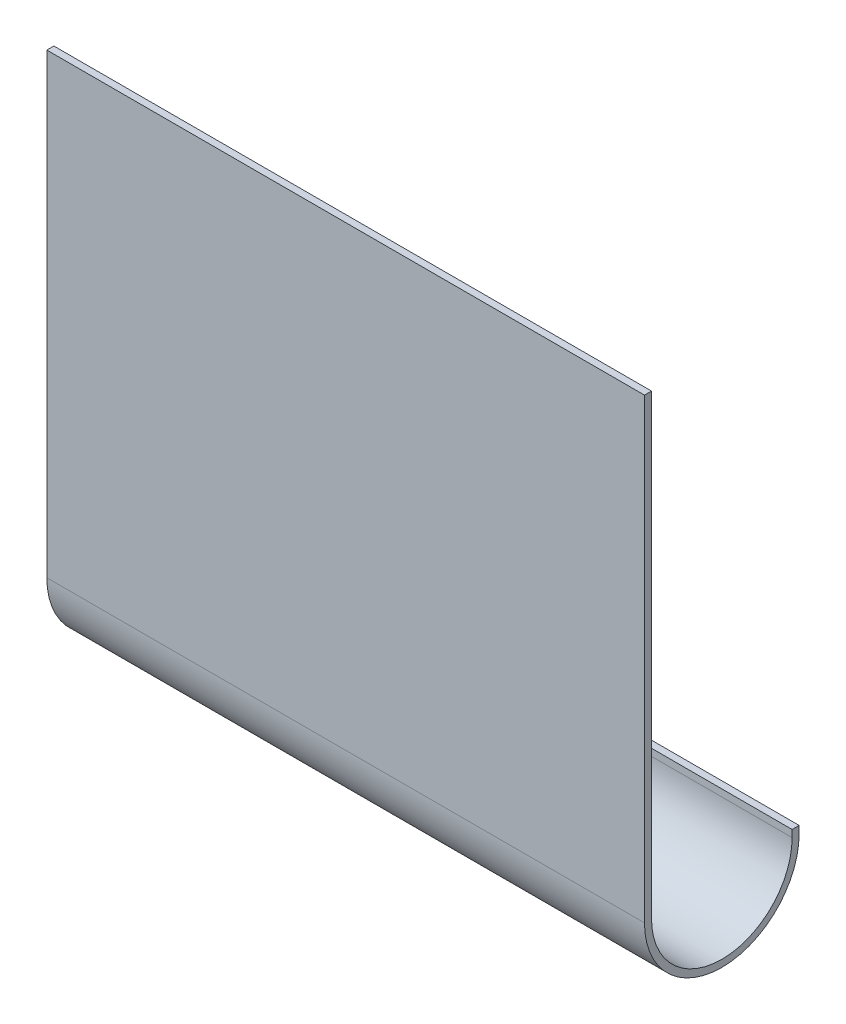
ISO-10303-21;
HEADER;
FILE_DESCRIPTION(('STEP AP214'),'2;1');
FILE_NAME('part.step','',(''),(''),'','','');
FILE_SCHEMA(('AUTOMOTIVE_DESIGN { 1 0 10303 214 1 1 1 1 }'));
ENDSEC;
DATA;
#1=APPLICATION_CONTEXT('core data for automotive mechanical design processes');
#2=APPLICATION_PROTOCOL_DEFINITION('international standard','automotive_design',2000,#1);
#3=PRODUCT_CONTEXT('',#1,'mechanical');
#4=PRODUCT('Part','Part','',(#3));
#5=PRODUCT_RELATED_PRODUCT_CATEGORY('part','',(#4));
#6=PRODUCT_DEFINITION_FORMATION('','',#4);
#7=PRODUCT_DEFINITION_CONTEXT('part definition',#1,'design');
#8=PRODUCT_DEFINITION('design','',#6,#7);
#9=PRODUCT_DEFINITION_SHAPE('','',#8);
#10=(LENGTH_UNIT() NAMED_UNIT(*) SI_UNIT(.MILLI.,.METRE.));
#11=(NAMED_UNIT(*) PLANE_ANGLE_UNIT() SI_UNIT($,.RADIAN.));
#12=(NAMED_UNIT(*) SI_UNIT($,.STERADIAN.) SOLID_ANGLE_UNIT());
#13=UNCERTAINTY_MEASURE_WITH_UNIT(LENGTH_MEASURE(1.E-05),#10,'distance_accuracy_value','');
#14=(GEOMETRIC_REPRESENTATION_CONTEXT(3) GLOBAL_UNCERTAINTY_ASSIGNED_CONTEXT((#13)) GLOBAL_UNIT_ASSIGNED_CONTEXT((#10,
#11,#12)) REPRESENTATION_CONTEXT('',''));
#15=CARTESIAN_POINT('',(0.,0.,0.));
#16=DIRECTION('',(0.,0.,1.));
#17=DIRECTION('',(1.,0.,0.));
#18=AXIS2_PLACEMENT_3D('',#15,#16,#17);
#19=CARTESIAN_POINT('',(4.25,-6.4,0.));
#20=DIRECTION('',(0.,-1.,0.));
#21=DIRECTION('',(0.,0.,-1.));
#22=AXIS2_PLACEMENT_3D('',#19,#20,#21);
#23=PLANE('',#22);
#24=DIRECTION('',(-1.,0.,0.));
#25=VECTOR('',#24,1.);
#26=CARTESIAN_POINT('',(4.25,-6.4,0.));
#27=LINE('',#26,#25);
#28=CARTESIAN_POINT('',(4.25,-6.4,0.));
#29=VERTEX_POINT('',#28);
#30=CARTESIAN_POINT('',(-4.25,-6.4,0.));
#31=VERTEX_POINT('',#30);
#32=EDGE_CURVE('E151',#29,#31,#27,.T.);
#33=ORIENTED_EDGE('',*,*,#32,.T.);
#34=DIRECTION('',(0.,0.,1.));
#35=VECTOR('',#34,1.);
#36=CARTESIAN_POINT('',(-4.25,-6.4,0.));
#37=LINE('',#36,#35);
#38=CARTESIAN_POINT('',(-4.25,-6.4,0.1));
#39=VERTEX_POINT('',#38);
#40=EDGE_CURVE('E112',#31,#39,#37,.T.);
#41=ORIENTED_EDGE('',*,*,#40,.T.);
#42=DIRECTION('',(-1.,0.,0.));
#43=VECTOR('',#42,1.);
#44=CARTESIAN_POINT('',(4.25,-6.4,0.1));
#45=LINE('',#44,#43);
#46=CARTESIAN_POINT('',(4.25,-6.4,0.1));
#47=VERTEX_POINT('',#46);
#48=EDGE_CURVE('E106',#47,#39,#45,.T.);
#49=ORIENTED_EDGE('',*,*,#48,.F.);
#50=DIRECTION('',(0.,0.,1.));
#51=VECTOR('',#50,1.);
#52=CARTESIAN_POINT('',(4.25,-6.4,0.));
#53=LINE('',#52,#51);
#54=EDGE_CURVE('E11',#29,#47,#53,.T.);
#55=ORIENTED_EDGE('',*,*,#54,.F.);
#56=EDGE_LOOP('',(#33,#41,#49,#55));
#57=FACE_BOUND('',#56,.T.);
#58=ADVANCED_FACE('F17',(#57),#23,.F.);
#59=CARTESIAN_POINT('',(0.,-9.65,0.1));
#60=DIRECTION('',(0.,0.,1.));
#61=DIRECTION('',(1.,0.,0.));
#62=AXIS2_PLACEMENT_3D('',#59,#60,#61);
#63=PLANE('',#62);
#64=ORIENTED_EDGE('',*,*,#48,.T.);
#65=DIRECTION('',(0.,-1.,0.));
#66=VECTOR('',#65,1.);
#67=CARTESIAN_POINT('',(-4.25,-6.4,0.1));
#68=LINE('',#67,#66);
#69=CARTESIAN_POINT('',(-4.25,-12.9,0.1));
#70=VERTEX_POINT('',#69);
#71=EDGE_CURVE('E101',#39,#70,#68,.T.);
#72=ORIENTED_EDGE('',*,*,#71,.T.);
#73=DIRECTION('',(1.,0.,0.));
#74=VECTOR('',#73,1.);
#75=CARTESIAN_POINT('',(-4.25,-12.9,0.1));
#76=LINE('',#75,#74);
#77=CARTESIAN_POINT('',(4.25,-12.9,0.1));
#78=VERTEX_POINT('',#77);
#79=EDGE_CURVE('E104',#70,#78,#76,.T.);
#80=ORIENTED_EDGE('',*,*,#79,.T.);
#81=DIRECTION('',(0.,1.,0.));
#82=VECTOR('',#81,1.);
#83=CARTESIAN_POINT('',(4.25,-12.9,0.1));
#84=LINE('',#83,#82);
#85=EDGE_CURVE('E25',#78,#47,#84,.T.);
#86=ORIENTED_EDGE('',*,*,#85,.T.);
#87=EDGE_LOOP('',(#64,#72,#80,#86));
#88=FACE_BOUND('',#87,.T.);
#89=ADVANCED_FACE('F103',(#88),#63,.T.);
#90=CARTESIAN_POINT('',(0.,-9.65,0.));
#91=DIRECTION('',(0.,0.,1.));
#92=DIRECTION('',(1.,0.,0.));
#93=AXIS2_PLACEMENT_3D('',#90,#91,#92);
#94=PLANE('',#93);
#95=DIRECTION('',(0.,1.,0.));
#96=VECTOR('',#95,1.);
#97=CARTESIAN_POINT('',(4.25,-12.9,0.));
#98=LINE('',#97,#96);
#99=CARTESIAN_POINT('',(4.25,-12.9,0.));
#100=VERTEX_POINT('',#99);
#101=EDGE_CURVE('E67',#100,#29,#98,.T.);
#102=ORIENTED_EDGE('',*,*,#101,.F.);
#103=DIRECTION('',(1.,0.,0.));
#104=VECTOR('',#103,1.);
#105=CARTESIAN_POINT('',(-4.25,-12.9,0.));
#106=LINE('',#105,#104);
#107=CARTESIAN_POINT('',(-4.25,-12.9,0.));
#108=VERTEX_POINT('',#107);
#109=EDGE_CURVE('E167',#108,#100,#106,.T.);
#110=ORIENTED_EDGE('',*,*,#109,.F.);
#111=DIRECTION('',(0.,-1.,0.));
#112=VECTOR('',#111,1.);
#113=CARTESIAN_POINT('',(-4.25,-6.4,0.));
#114=LINE('',#113,#112);
#115=EDGE_CURVE('E113',#31,#108,#114,.T.);
#116=ORIENTED_EDGE('',*,*,#115,.F.);
#117=ORIENTED_EDGE('',*,*,#32,.F.);
#118=EDGE_LOOP('',(#102,#110,#116,#117));
#119=FACE_BOUND('',#118,.T.);
#120=ADVANCED_FACE('F183',(#119),#94,.F.);
#121=CARTESIAN_POINT('',(4.25,-12.8,-2.));
#122=DIRECTION('',(-1.,0.,0.));
#123=DIRECTION('',(0.,0.,1.));
#124=AXIS2_PLACEMENT_3D('',#121,#122,#123);
#125=PLANE('',#124);
#126=DIRECTION('',(0.,-1.,0.));
#127=VECTOR('',#126,1.);
#128=CARTESIAN_POINT('',(4.25,-12.8,-2.));
#129=LINE('',#128,#127);
#130=CARTESIAN_POINT('',(4.25,-12.8,-2.));
#131=VERTEX_POINT('',#130);
#132=CARTESIAN_POINT('',(4.25,-12.9,-2.));
#133=VERTEX_POINT('',#132);
#134=EDGE_CURVE('E152',#131,#133,#129,.T.);
#135=ORIENTED_EDGE('',*,*,#134,.T.);
#136=CARTESIAN_POINT('',(4.25,-12.9,-1.));
#137=DIRECTION('',(1.,0.,0.));
#138=DIRECTION('',(0.,0.,1.));
#139=AXIS2_PLACEMENT_3D('',#136,#137,#138);
#140=CIRCLE('',#139,1.);
#141=EDGE_CURVE('E164',#100,#133,#140,.T.);
#142=ORIENTED_EDGE('',*,*,#141,.F.);
#143=ORIENTED_EDGE('',*,*,#101,.T.);
#144=ORIENTED_EDGE('',*,*,#54,.T.);
#145=ORIENTED_EDGE('',*,*,#85,.F.);
#146=CARTESIAN_POINT('',(4.25,-12.9,-1.));
#147=DIRECTION('',(1.,0.,0.));
#148=DIRECTION('',(0.,0.,1.));
#149=AXIS2_PLACEMENT_3D('',#146,#147,#148);
#150=CIRCLE('',#149,1.1);
#151=CARTESIAN_POINT('',(4.25,-12.9,-2.1));
#152=VERTEX_POINT('',#151);
#153=EDGE_CURVE('E121',#78,#152,#150,.T.);
#154=ORIENTED_EDGE('',*,*,#153,.T.);
#155=DIRECTION('',(0.,-1.,0.));
#156=VECTOR('',#155,1.);
#157=CARTESIAN_POINT('',(4.25,-12.8,-2.1));
#158=LINE('',#157,#156);
#159=CARTESIAN_POINT('',(4.25,-12.8,-2.1));
#160=VERTEX_POINT('',#159);
#161=EDGE_CURVE('E160',#160,#152,#158,.T.);
#162=ORIENTED_EDGE('',*,*,#161,.F.);
#163=DIRECTION('',(0.,0.,-1.));
#164=VECTOR('',#163,1.);
#165=CARTESIAN_POINT('',(4.25,-12.8,-2.));
#166=LINE('',#165,#164);
#167=EDGE_CURVE('E139',#131,#160,#166,.T.);
#168=ORIENTED_EDGE('',*,*,#167,.F.);
#169=EDGE_LOOP('',(#135,#142,#143,#144,#145,#154,#162,#168));
#170=FACE_BOUND('',#169,.T.);
#171=ADVANCED_FACE('F219',(#170),#125,.F.);
#172=CARTESIAN_POINT('',(-4.25,-12.9,-1.));
#173=DIRECTION('',(1.,0.,0.));
#174=DIRECTION('',(0.,0.,1.));
#175=AXIS2_PLACEMENT_3D('',#172,#173,#174);
#176=CYLINDRICAL_SURFACE('',#175,1.1);
#177=CARTESIAN_POINT('',(-4.25,-12.9,-1.));
#178=DIRECTION('',(1.,0.,0.));
#179=DIRECTION('',(0.,0.,1.));
#180=AXIS2_PLACEMENT_3D('',#177,#178,#179);
#181=CIRCLE('',#180,1.1);
#182=CARTESIAN_POINT('',(-4.25,-12.9,-2.1));
#183=VERTEX_POINT('',#182);
#184=EDGE_CURVE('E119',#70,#183,#181,.T.);
#185=ORIENTED_EDGE('',*,*,#184,.T.);
#186=DIRECTION('',(1.,0.,0.));
#187=VECTOR('',#186,1.);
#188=CARTESIAN_POINT('',(-4.25,-12.9,-2.1));
#189=LINE('',#188,#187);
#190=EDGE_CURVE('E157',#183,#152,#189,.T.);
#191=ORIENTED_EDGE('',*,*,#190,.T.);
#192=ORIENTED_EDGE('',*,*,#153,.F.);
#193=ORIENTED_EDGE('',*,*,#79,.F.);
#194=EDGE_LOOP('',(#185,#191,#192,#193));
#195=FACE_BOUND('',#194,.T.);
#196=ADVANCED_FACE('F117',(#195),#176,.T.);
#197=CARTESIAN_POINT('',(4.25,-12.9,-1.));
#198=DIRECTION('',(-1.,0.,0.));
#199=DIRECTION('',(0.,0.,1.));
#200=AXIS2_PLACEMENT_3D('',#197,#198,#199);
#201=CYLINDRICAL_SURFACE('',#200,1.);
#202=ORIENTED_EDGE('',*,*,#141,.T.);
#203=DIRECTION('',(-1.,0.,0.));
#204=VECTOR('',#203,1.);
#205=CARTESIAN_POINT('',(4.25,-12.9,-2.));
#206=LINE('',#205,#204);
#207=CARTESIAN_POINT('',(-4.25,-12.9,-2.));
#208=VERTEX_POINT('',#207);
#209=EDGE_CURVE('E156',#133,#208,#206,.T.);
#210=ORIENTED_EDGE('',*,*,#209,.T.);
#211=CARTESIAN_POINT('',(-4.25,-12.9,-1.));
#212=DIRECTION('',(1.,0.,0.));
#213=DIRECTION('',(0.,0.,1.));
#214=AXIS2_PLACEMENT_3D('',#211,#212,#213);
#215=CIRCLE('',#214,1.);
#216=EDGE_CURVE('E131',#108,#208,#215,.T.);
#217=ORIENTED_EDGE('',*,*,#216,.F.);
#218=ORIENTED_EDGE('',*,*,#109,.T.);
#219=EDGE_LOOP('',(#202,#210,#217,#218));
#220=FACE_BOUND('',#219,.T.);
#221=ADVANCED_FACE('F188',(#220),#201,.F.);
#222=CARTESIAN_POINT('',(0.,-12.85,-2.1));
#223=DIRECTION('',(0.,0.,-1.));
#224=DIRECTION('',(0.,-1.,0.));
#225=AXIS2_PLACEMENT_3D('',#222,#223,#224);
#226=PLANE('',#225);
#227=ORIENTED_EDGE('',*,*,#190,.F.);
#228=DIRECTION('',(0.,1.,0.));
#229=VECTOR('',#228,1.);
#230=CARTESIAN_POINT('',(-4.25,-12.9,-2.1));
#231=LINE('',#230,#229);
#232=CARTESIAN_POINT('',(-4.25,-12.8,-2.1));
#233=VERTEX_POINT('',#232);
#234=EDGE_CURVE('E128',#183,#233,#231,.T.);
#235=ORIENTED_EDGE('',*,*,#234,.T.);
#236=DIRECTION('',(1.,0.,0.));
#237=VECTOR('',#236,1.);
#238=CARTESIAN_POINT('',(-4.25,-12.8,-2.1));
#239=LINE('',#238,#237);
#240=EDGE_CURVE('E148',#233,#160,#239,.T.);
#241=ORIENTED_EDGE('',*,*,#240,.T.);
#242=ORIENTED_EDGE('',*,*,#161,.T.);
#243=EDGE_LOOP('',(#227,#235,#241,#242));
#244=FACE_BOUND('',#243,.T.);
#245=ADVANCED_FACE('F214',(#244),#226,.T.);
#246=CARTESIAN_POINT('',(0.,-12.85,-2.));
#247=DIRECTION('',(0.,0.,-1.));
#248=DIRECTION('',(0.,-1.,0.));
#249=AXIS2_PLACEMENT_3D('',#246,#247,#248);
#250=PLANE('',#249);
#251=ORIENTED_EDGE('',*,*,#134,.F.);
#252=DIRECTION('',(1.,0.,0.));
#253=VECTOR('',#252,1.);
#254=CARTESIAN_POINT('',(-4.25,-12.8,-2.));
#255=LINE('',#254,#253);
#256=CARTESIAN_POINT('',(-4.25,-12.8,-2.));
#257=VERTEX_POINT('',#256);
#258=EDGE_CURVE('E130',#257,#131,#255,.T.);
#259=ORIENTED_EDGE('',*,*,#258,.F.);
#260=DIRECTION('',(0.,1.,0.));
#261=VECTOR('',#260,1.);
#262=CARTESIAN_POINT('',(-4.25,-12.9,-2.));
#263=LINE('',#262,#261);
#264=EDGE_CURVE('E192',#208,#257,#263,.T.);
#265=ORIENTED_EDGE('',*,*,#264,.F.);
#266=ORIENTED_EDGE('',*,*,#209,.F.);
#267=EDGE_LOOP('',(#251,#259,#265,#266));
#268=FACE_BOUND('',#267,.T.);
#269=ADVANCED_FACE('F196',(#268),#250,.F.);
#270=CARTESIAN_POINT('',(-4.25,-12.8,-2.));
#271=DIRECTION('',(0.,-1.,0.));
#272=DIRECTION('',(0.,0.,-1.));
#273=AXIS2_PLACEMENT_3D('',#270,#271,#272);
#274=PLANE('',#273);
#275=ORIENTED_EDGE('',*,*,#258,.T.);
#276=ORIENTED_EDGE('',*,*,#167,.T.);
#277=ORIENTED_EDGE('',*,*,#240,.F.);
#278=DIRECTION('',(0.,0.,-1.));
#279=VECTOR('',#278,1.);
#280=CARTESIAN_POINT('',(-4.25,-12.8,-2.));
#281=LINE('',#280,#279);
#282=EDGE_CURVE('E199',#257,#233,#281,.T.);
#283=ORIENTED_EDGE('',*,*,#282,.F.);
#284=EDGE_LOOP('',(#275,#276,#277,#283));
#285=FACE_BOUND('',#284,.T.);
#286=ADVANCED_FACE('F218',(#285),#274,.F.);
#287=CARTESIAN_POINT('',(-4.25,-12.9,-2.));
#288=DIRECTION('',(1.,0.,0.));
#289=DIRECTION('',(0.,0.,1.));
#290=AXIS2_PLACEMENT_3D('',#287,#288,#289);
#291=PLANE('',#290);
#292=ORIENTED_EDGE('',*,*,#264,.T.);
#293=ORIENTED_EDGE('',*,*,#282,.T.);
#294=ORIENTED_EDGE('',*,*,#234,.F.);
#295=ORIENTED_EDGE('',*,*,#184,.F.);
#296=ORIENTED_EDGE('',*,*,#71,.F.);
#297=ORIENTED_EDGE('',*,*,#40,.F.);
#298=ORIENTED_EDGE('',*,*,#115,.T.);
#299=ORIENTED_EDGE('',*,*,#216,.T.);
#300=EDGE_LOOP('',(#292,#293,#294,#295,#296,#297,#298,#299));
#301=FACE_BOUND('',#300,.T.);
#302=ADVANCED_FACE('F125',(#301),#291,.F.);
#303=CLOSED_SHELL('',(#58,#89,#120,#171,#196,#221,#245,#269,#286,#302));
#304=MANIFOLD_SOLID_BREP('B1',#303);
#305=ADVANCED_BREP_SHAPE_REPRESENTATION('',(#18,#304),#14);
#306=SHAPE_DEFINITION_REPRESENTATION(#9,#305);
ENDSEC;
END-ISO-10303-21;
